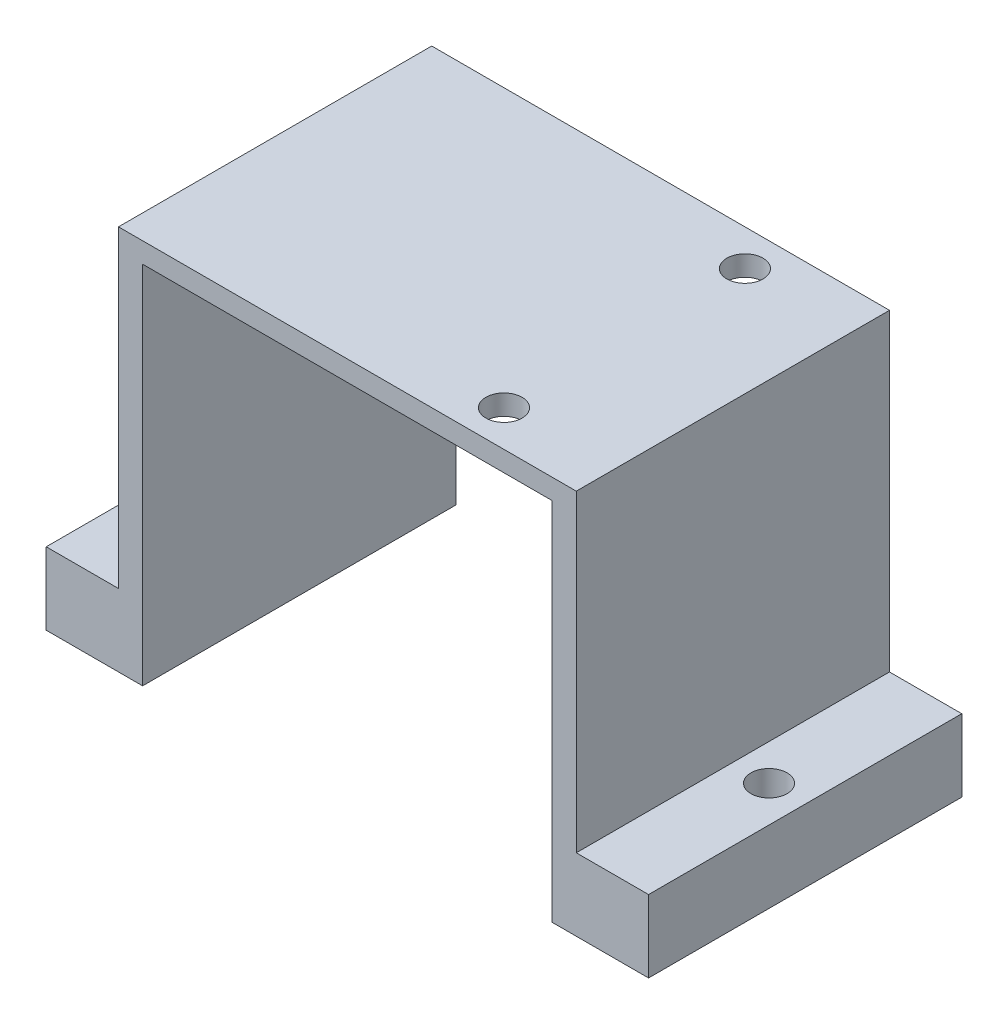
ISO-10303-21;
HEADER;
FILE_DESCRIPTION(('STEP AP214'),'2;1');
FILE_NAME('part.step','',(''),(''),'','','');
FILE_SCHEMA(('AUTOMOTIVE_DESIGN { 1 0 10303 214 1 1 1 1 }'));
ENDSEC;
DATA;
#1=APPLICATION_CONTEXT('core data for automotive mechanical design processes');
#2=APPLICATION_PROTOCOL_DEFINITION('international standard','automotive_design',2000,#1);
#3=PRODUCT_CONTEXT('',#1,'mechanical');
#4=PRODUCT('Part','Part','',(#3));
#5=PRODUCT_RELATED_PRODUCT_CATEGORY('part','',(#4));
#6=PRODUCT_DEFINITION_FORMATION('','',#4);
#7=PRODUCT_DEFINITION_CONTEXT('part definition',#1,'design');
#8=PRODUCT_DEFINITION('design','',#6,#7);
#9=PRODUCT_DEFINITION_SHAPE('','',#8);
#10=(LENGTH_UNIT() NAMED_UNIT(*) SI_UNIT(.MILLI.,.METRE.));
#11=(NAMED_UNIT(*) PLANE_ANGLE_UNIT() SI_UNIT($,.RADIAN.));
#12=(NAMED_UNIT(*) SI_UNIT($,.STERADIAN.) SOLID_ANGLE_UNIT());
#13=UNCERTAINTY_MEASURE_WITH_UNIT(LENGTH_MEASURE(1.E-05),#10,'distance_accuracy_value','');
#14=(GEOMETRIC_REPRESENTATION_CONTEXT(3) GLOBAL_UNCERTAINTY_ASSIGNED_CONTEXT((#13)) GLOBAL_UNIT_ASSIGNED_CONTEXT((#10,
#11,#12)) REPRESENTATION_CONTEXT('',''));
#15=CARTESIAN_POINT('',(0.,0.,0.));
#16=DIRECTION('',(0.,0.,1.));
#17=DIRECTION('',(1.,0.,0.));
#18=AXIS2_PLACEMENT_3D('',#15,#16,#17);
#19=CARTESIAN_POINT('',(-25.,0.,26.));
#20=DIRECTION('',(1.,0.,0.));
#21=DIRECTION('',(0.,0.,-1.));
#22=AXIS2_PLACEMENT_3D('',#19,#20,#21);
#23=PLANE('',#22);
#24=DIRECTION('',(0.,-1.,0.));
#25=VECTOR('',#24,1.);
#26=CARTESIAN_POINT('',(-25.,0.,0.));
#27=LINE('',#26,#25);
#28=CARTESIAN_POINT('',(-25.,-9.99999999999999,0.));
#29=VERTEX_POINT('',#28);
#30=CARTESIAN_POINT('',(-25.,-16.,0.));
#31=VERTEX_POINT('',#30);
#32=EDGE_CURVE('E200',#29,#31,#27,.T.);
#33=ORIENTED_EDGE('',*,*,#32,.T.);
#34=DIRECTION('',(0.,0.,-1.));
#35=VECTOR('',#34,1.);
#36=CARTESIAN_POINT('',(-25.,-16.,26.));
#37=LINE('',#36,#35);
#38=CARTESIAN_POINT('',(-25.,-16.,26.));
#39=VERTEX_POINT('',#38);
#40=EDGE_CURVE('E11',#39,#31,#37,.T.);
#41=ORIENTED_EDGE('',*,*,#40,.F.);
#42=DIRECTION('',(0.,-1.,0.));
#43=VECTOR('',#42,1.);
#44=CARTESIAN_POINT('',(-25.,0.,26.));
#45=LINE('',#44,#43);
#46=CARTESIAN_POINT('',(-25.,-9.99999999999999,26.));
#47=VERTEX_POINT('',#46);
#48=EDGE_CURVE('E209',#47,#39,#45,.T.);
#49=ORIENTED_EDGE('',*,*,#48,.F.);
#50=DIRECTION('',(0.,0.,-1.));
#51=VECTOR('',#50,1.);
#52=CARTESIAN_POINT('',(-25.,-9.99999999999999,26.));
#53=LINE('',#52,#51);
#54=EDGE_CURVE('E240',#47,#29,#53,.T.);
#55=ORIENTED_EDGE('',*,*,#54,.T.);
#56=EDGE_LOOP('',(#33,#41,#49,#55));
#57=FACE_BOUND('',#56,.T.);
#58=ADVANCED_FACE('F35',(#57),#23,.F.);
#59=CARTESIAN_POINT('',(0.,-16.,26.));
#60=DIRECTION('',(0.,1.,0.));
#61=DIRECTION('',(0.,0.,1.));
#62=AXIS2_PLACEMENT_3D('',#59,#60,#61);
#63=PLANE('',#62);
#64=CARTESIAN_POINT('',(-21.9999999999998,-16.0000000000017,13.));
#65=DIRECTION('',(0.,1.,0.));
#66=DIRECTION('',(-1.,0.,0.));
#67=AXIS2_PLACEMENT_3D('',#64,#65,#66);
#68=CIRCLE('',#67,1.5);
#69=CARTESIAN_POINT('',(-23.4999999999998,-16.0000000000018,13.));
#70=VERTEX_POINT('',#69);
#71=EDGE_CURVE('E192',#70,#70,#68,.F.);
#72=ORIENTED_EDGE('',*,*,#71,.F.);
#73=EDGE_LOOP('',(#72));
#74=FACE_BOUND('',#73,.T.);
#75=DIRECTION('',(1.,0.,0.));
#76=VECTOR('',#75,1.);
#77=CARTESIAN_POINT('',(0.,-16.,0.));
#78=LINE('',#77,#76);
#79=CARTESIAN_POINT('',(-17.,-16.,0.));
#80=VERTEX_POINT('',#79);
#81=EDGE_CURVE('E243',#31,#80,#78,.T.);
#82=ORIENTED_EDGE('',*,*,#81,.T.);
#83=DIRECTION('',(0.,0.,-1.));
#84=VECTOR('',#83,1.);
#85=CARTESIAN_POINT('',(-17.,-16.,26.));
#86=LINE('',#85,#84);
#87=CARTESIAN_POINT('',(-17.,-16.,26.));
#88=VERTEX_POINT('',#87);
#89=EDGE_CURVE('E42',#88,#80,#86,.T.);
#90=ORIENTED_EDGE('',*,*,#89,.F.);
#91=DIRECTION('',(1.,0.,0.));
#92=VECTOR('',#91,1.);
#93=CARTESIAN_POINT('',(0.,-16.,26.));
#94=LINE('',#93,#92);
#95=EDGE_CURVE('E212',#39,#88,#94,.T.);
#96=ORIENTED_EDGE('',*,*,#95,.F.);
#97=ORIENTED_EDGE('',*,*,#40,.T.);
#98=EDGE_LOOP('',(#82,#90,#96,#97));
#99=FACE_BOUND('',#98,.T.);
#100=ADVANCED_FACE('F315',(#74,#99),#63,.F.);
#101=CARTESIAN_POINT('',(-17.,0.,26.));
#102=DIRECTION('',(-1.,0.,0.));
#103=DIRECTION('',(0.,0.,1.));
#104=AXIS2_PLACEMENT_3D('',#101,#102,#103);
#105=PLANE('',#104);
#106=CARTESIAN_POINT('',(-17.,11.,8.));
#107=DIRECTION('',(-1.,0.,0.));
#108=DIRECTION('',(0.,0.,1.));
#109=AXIS2_PLACEMENT_3D('',#106,#107,#108);
#110=CIRCLE('',#109,3.);
#111=CARTESIAN_POINT('',(-17.,14.,8.));
#112=VERTEX_POINT('',#111);
#113=CARTESIAN_POINT('',(-17.,8.00000000000001,8.));
#114=VERTEX_POINT('',#113);
#115=EDGE_CURVE('E178',#112,#114,#110,.T.);
#116=ORIENTED_EDGE('',*,*,#115,.T.);
#117=DIRECTION('',(0.,0.,1.));
#118=VECTOR('',#117,1.);
#119=CARTESIAN_POINT('',(-17.,8.00000000000001,26.));
#120=LINE('',#119,#118);
#121=CARTESIAN_POINT('',(-17.,8.00000000000001,18.));
#122=VERTEX_POINT('',#121);
#123=EDGE_CURVE('E181',#114,#122,#120,.T.);
#124=ORIENTED_EDGE('',*,*,#123,.T.);
#125=CARTESIAN_POINT('',(-17.,11.,18.));
#126=DIRECTION('',(-1.,0.,0.));
#127=DIRECTION('',(0.,0.,1.));
#128=AXIS2_PLACEMENT_3D('',#125,#126,#127);
#129=CIRCLE('',#128,3.);
#130=CARTESIAN_POINT('',(-17.,14.,18.));
#131=VERTEX_POINT('',#130);
#132=EDGE_CURVE('E173',#122,#131,#129,.T.);
#133=ORIENTED_EDGE('',*,*,#132,.T.);
#134=DIRECTION('',(0.,0.,1.));
#135=VECTOR('',#134,1.);
#136=CARTESIAN_POINT('',(-17.,14.,26.));
#137=LINE('',#136,#135);
#138=EDGE_CURVE('E153',#112,#131,#137,.T.);
#139=ORIENTED_EDGE('',*,*,#138,.F.);
#140=EDGE_LOOP('',(#116,#124,#133,#139));
#141=FACE_BOUND('',#140,.T.);
#142=DIRECTION('',(0.,1.,0.));
#143=VECTOR('',#142,1.);
#144=CARTESIAN_POINT('',(-17.,0.,0.));
#145=LINE('',#144,#143);
#146=CARTESIAN_POINT('',(-17.,14.3157894736842,0.));
#147=VERTEX_POINT('',#146);
#148=EDGE_CURVE('E245',#80,#147,#145,.T.);
#149=ORIENTED_EDGE('',*,*,#148,.T.);
#150=DIRECTION('',(0.,0.,-1.));
#151=VECTOR('',#150,1.);
#152=CARTESIAN_POINT('',(-17.,14.3157894736842,26.));
#153=LINE('',#152,#151);
#154=CARTESIAN_POINT('',(-17.,14.3157894736842,26.));
#155=VERTEX_POINT('',#154);
#156=EDGE_CURVE('E290',#155,#147,#153,.T.);
#157=ORIENTED_EDGE('',*,*,#156,.F.);
#158=DIRECTION('',(0.,1.,0.));
#159=VECTOR('',#158,1.);
#160=CARTESIAN_POINT('',(-17.,0.,26.));
#161=LINE('',#160,#159);
#162=EDGE_CURVE('E215',#88,#155,#161,.T.);
#163=ORIENTED_EDGE('',*,*,#162,.F.);
#164=ORIENTED_EDGE('',*,*,#89,.T.);
#165=EDGE_LOOP('',(#149,#157,#163,#164));
#166=FACE_BOUND('',#165,.T.);
#167=ADVANCED_FACE('F297',(#141,#166),#105,.F.);
#168=CARTESIAN_POINT('',(0.,14.3157894736842,26.));
#169=DIRECTION('',(0.,1.,0.));
#170=DIRECTION('',(0.,0.,1.));
#171=AXIS2_PLACEMENT_3D('',#168,#169,#170);
#172=PLANE('',#171);
#173=CARTESIAN_POINT('',(10.,14.3157894736842,23.));
#174=DIRECTION('',(0.,-1.,0.));
#175=DIRECTION('',(0.,0.,-1.));
#176=AXIS2_PLACEMENT_3D('',#173,#174,#175);
#177=CIRCLE('',#176,1.5);
#178=CARTESIAN_POINT('',(10.,14.3157894736842,21.5));
#179=VERTEX_POINT('',#178);
#180=EDGE_CURVE('E201',#179,#179,#177,.T.);
#181=ORIENTED_EDGE('',*,*,#180,.F.);
#182=EDGE_LOOP('',(#181));
#183=FACE_BOUND('',#182,.T.);
#184=CARTESIAN_POINT('',(10.,14.3157894736842,3.));
#185=DIRECTION('',(0.,-1.,0.));
#186=DIRECTION('',(0.,0.,-1.));
#187=AXIS2_PLACEMENT_3D('',#184,#185,#186);
#188=CIRCLE('',#187,1.5);
#189=CARTESIAN_POINT('',(10.,14.3157894736842,1.5));
#190=VERTEX_POINT('',#189);
#191=EDGE_CURVE('E188',#190,#190,#188,.T.);
#192=ORIENTED_EDGE('',*,*,#191,.F.);
#193=EDGE_LOOP('',(#192));
#194=FACE_BOUND('',#193,.T.);
#195=DIRECTION('',(1.,0.,0.));
#196=VECTOR('',#195,1.);
#197=CARTESIAN_POINT('',(0.,14.3157894736842,0.));
#198=LINE('',#197,#196);
#199=CARTESIAN_POINT('',(17.,14.3157894736842,0.));
#200=VERTEX_POINT('',#199);
#201=EDGE_CURVE('E247',#147,#200,#198,.T.);
#202=ORIENTED_EDGE('',*,*,#201,.T.);
#203=DIRECTION('',(0.,0.,-1.));
#204=VECTOR('',#203,1.);
#205=CARTESIAN_POINT('',(17.,14.3157894736842,26.));
#206=LINE('',#205,#204);
#207=CARTESIAN_POINT('',(17.,14.3157894736842,26.));
#208=VERTEX_POINT('',#207);
#209=EDGE_CURVE('E288',#208,#200,#206,.T.);
#210=ORIENTED_EDGE('',*,*,#209,.F.);
#211=DIRECTION('',(1.,0.,0.));
#212=VECTOR('',#211,1.);
#213=CARTESIAN_POINT('',(0.,14.3157894736842,26.));
#214=LINE('',#213,#212);
#215=EDGE_CURVE('E217',#155,#208,#214,.T.);
#216=ORIENTED_EDGE('',*,*,#215,.F.);
#217=ORIENTED_EDGE('',*,*,#156,.T.);
#218=EDGE_LOOP('',(#202,#210,#216,#217));
#219=FACE_BOUND('',#218,.T.);
#220=ADVANCED_FACE('F308',(#183,#194,#219),#172,.F.);
#221=CARTESIAN_POINT('',(17.,0.,26.));
#222=DIRECTION('',(-1.,0.,0.));
#223=DIRECTION('',(0.,-1.,0.));
#224=AXIS2_PLACEMENT_3D('',#221,#222,#223);
#225=PLANE('',#224);
#226=DIRECTION('',(0.,1.,0.));
#227=VECTOR('',#226,1.);
#228=CARTESIAN_POINT('',(17.,0.,0.));
#229=LINE('',#228,#227);
#230=CARTESIAN_POINT('',(17.,-16.,0.));
#231=VERTEX_POINT('',#230);
#232=EDGE_CURVE('E250',#231,#200,#229,.T.);
#233=ORIENTED_EDGE('',*,*,#232,.F.);
#234=DIRECTION('',(0.,0.,-1.));
#235=VECTOR('',#234,1.);
#236=CARTESIAN_POINT('',(17.,-16.,26.));
#237=LINE('',#236,#235);
#238=CARTESIAN_POINT('',(17.,-16.,26.));
#239=VERTEX_POINT('',#238);
#240=EDGE_CURVE('E286',#239,#231,#237,.T.);
#241=ORIENTED_EDGE('',*,*,#240,.F.);
#242=DIRECTION('',(0.,1.,0.));
#243=VECTOR('',#242,1.);
#244=CARTESIAN_POINT('',(17.,0.,26.));
#245=LINE('',#244,#243);
#246=EDGE_CURVE('E219',#239,#208,#245,.T.);
#247=ORIENTED_EDGE('',*,*,#246,.T.);
#248=ORIENTED_EDGE('',*,*,#209,.T.);
#249=EDGE_LOOP('',(#233,#241,#247,#248));
#250=FACE_BOUND('',#249,.T.);
#251=ADVANCED_FACE('F342',(#250),#225,.T.);
#252=CARTESIAN_POINT('',(0.,-16.,26.));
#253=DIRECTION('',(0.,1.,0.));
#254=DIRECTION('',(-1.,0.,0.));
#255=AXIS2_PLACEMENT_3D('',#252,#253,#254);
#256=PLANE('',#255);
#257=CARTESIAN_POINT('',(22.0000000000002,-16.0000000000001,13.));
#258=DIRECTION('',(0.,1.,0.));
#259=DIRECTION('',(-1.,0.,0.));
#260=AXIS2_PLACEMENT_3D('',#257,#258,#259);
#261=CIRCLE('',#260,1.5);
#262=CARTESIAN_POINT('',(20.5000000000002,-16.0000000000002,13.));
#263=VERTEX_POINT('',#262);
#264=EDGE_CURVE('E185',#263,#263,#261,.T.);
#265=ORIENTED_EDGE('',*,*,#264,.T.);
#266=EDGE_LOOP('',(#265));
#267=FACE_BOUND('',#266,.T.);
#268=DIRECTION('',(1.,0.,0.));
#269=VECTOR('',#268,1.);
#270=CARTESIAN_POINT('',(0.,-16.,0.));
#271=LINE('',#270,#269);
#272=CARTESIAN_POINT('',(25.,-16.,0.));
#273=VERTEX_POINT('',#272);
#274=EDGE_CURVE('E253',#231,#273,#271,.T.);
#275=ORIENTED_EDGE('',*,*,#274,.T.);
#276=DIRECTION('',(0.,0.,-1.));
#277=VECTOR('',#276,1.);
#278=CARTESIAN_POINT('',(25.,-16.,26.));
#279=LINE('',#278,#277);
#280=CARTESIAN_POINT('',(25.,-16.,26.));
#281=VERTEX_POINT('',#280);
#282=EDGE_CURVE('E284',#281,#273,#279,.T.);
#283=ORIENTED_EDGE('',*,*,#282,.F.);
#284=DIRECTION('',(1.,0.,0.));
#285=VECTOR('',#284,1.);
#286=CARTESIAN_POINT('',(0.,-16.,26.));
#287=LINE('',#286,#285);
#288=EDGE_CURVE('E222',#239,#281,#287,.T.);
#289=ORIENTED_EDGE('',*,*,#288,.F.);
#290=ORIENTED_EDGE('',*,*,#240,.T.);
#291=EDGE_LOOP('',(#275,#283,#289,#290));
#292=FACE_BOUND('',#291,.T.);
#293=ADVANCED_FACE('F344',(#267,#292),#256,.F.);
#294=CARTESIAN_POINT('',(25.,0.,26.));
#295=DIRECTION('',(1.,0.,0.));
#296=DIRECTION('',(0.,0.,-1.));
#297=AXIS2_PLACEMENT_3D('',#294,#295,#296);
#298=PLANE('',#297);
#299=DIRECTION('',(0.,-1.,0.));
#300=VECTOR('',#299,1.);
#301=CARTESIAN_POINT('',(25.,0.,0.));
#302=LINE('',#301,#300);
#303=CARTESIAN_POINT('',(25.,-9.99999999999999,0.));
#304=VERTEX_POINT('',#303);
#305=EDGE_CURVE('E256',#304,#273,#302,.T.);
#306=ORIENTED_EDGE('',*,*,#305,.F.);
#307=DIRECTION('',(0.,0.,-1.));
#308=VECTOR('',#307,1.);
#309=CARTESIAN_POINT('',(25.,-9.99999999999999,26.));
#310=LINE('',#309,#308);
#311=CARTESIAN_POINT('',(25.,-9.99999999999999,26.));
#312=VERTEX_POINT('',#311);
#313=EDGE_CURVE('E282',#312,#304,#310,.T.);
#314=ORIENTED_EDGE('',*,*,#313,.F.);
#315=DIRECTION('',(0.,-1.,0.));
#316=VECTOR('',#315,1.);
#317=CARTESIAN_POINT('',(25.,0.,26.));
#318=LINE('',#317,#316);
#319=EDGE_CURVE('E224',#312,#281,#318,.T.);
#320=ORIENTED_EDGE('',*,*,#319,.T.);
#321=ORIENTED_EDGE('',*,*,#282,.T.);
#322=EDGE_LOOP('',(#306,#314,#320,#321));
#323=FACE_BOUND('',#322,.T.);
#324=ADVANCED_FACE('F338',(#323),#298,.T.);
#325=CARTESIAN_POINT('',(0.,-9.99999999999999,26.));
#326=DIRECTION('',(0.,1.,0.));
#327=DIRECTION('',(-1.,0.,0.));
#328=AXIS2_PLACEMENT_3D('',#325,#326,#327);
#329=PLANE('',#328);
#330=CARTESIAN_POINT('',(22.,-9.99999999999917,13.));
#331=DIRECTION('',(0.,1.,0.));
#332=DIRECTION('',(-1.,0.,0.));
#333=AXIS2_PLACEMENT_3D('',#330,#331,#332);
#334=CIRCLE('',#333,1.5);
#335=CARTESIAN_POINT('',(20.5,-9.99999999999923,13.));
#336=VERTEX_POINT('',#335);
#337=EDGE_CURVE('E189',#336,#336,#334,.T.);
#338=ORIENTED_EDGE('',*,*,#337,.F.);
#339=EDGE_LOOP('',(#338));
#340=FACE_BOUND('',#339,.T.);
#341=DIRECTION('',(1.,0.,0.));
#342=VECTOR('',#341,1.);
#343=CARTESIAN_POINT('',(0.,-9.99999999999999,0.));
#344=LINE('',#343,#342);
#345=CARTESIAN_POINT('',(19.,-9.99999999999999,0.));
#346=VERTEX_POINT('',#345);
#347=EDGE_CURVE('E259',#346,#304,#344,.T.);
#348=ORIENTED_EDGE('',*,*,#347,.F.);
#349=DIRECTION('',(0.,0.,-1.));
#350=VECTOR('',#349,1.);
#351=CARTESIAN_POINT('',(19.,-9.99999999999999,26.));
#352=LINE('',#351,#350);
#353=CARTESIAN_POINT('',(19.,-9.99999999999999,26.));
#354=VERTEX_POINT('',#353);
#355=EDGE_CURVE('E280',#354,#346,#352,.T.);
#356=ORIENTED_EDGE('',*,*,#355,.F.);
#357=DIRECTION('',(1.,0.,0.));
#358=VECTOR('',#357,1.);
#359=CARTESIAN_POINT('',(0.,-9.99999999999999,26.));
#360=LINE('',#359,#358);
#361=EDGE_CURVE('E227',#354,#312,#360,.T.);
#362=ORIENTED_EDGE('',*,*,#361,.T.);
#363=ORIENTED_EDGE('',*,*,#313,.T.);
#364=EDGE_LOOP('',(#348,#356,#362,#363));
#365=FACE_BOUND('',#364,.T.);
#366=ADVANCED_FACE('F332',(#340,#365),#329,.T.);
#367=CARTESIAN_POINT('',(19.,0.,26.));
#368=DIRECTION('',(-1.,0.,0.));
#369=DIRECTION('',(0.,-1.,0.));
#370=AXIS2_PLACEMENT_3D('',#367,#368,#369);
#371=PLANE('',#370);
#372=DIRECTION('',(0.,1.,0.));
#373=VECTOR('',#372,1.);
#374=CARTESIAN_POINT('',(19.,0.,0.));
#375=LINE('',#374,#373);
#376=CARTESIAN_POINT('',(19.,16.,0.));
#377=VERTEX_POINT('',#376);
#378=EDGE_CURVE('E262',#346,#377,#375,.T.);
#379=ORIENTED_EDGE('',*,*,#378,.T.);
#380=DIRECTION('',(0.,0.,-1.));
#381=VECTOR('',#380,1.);
#382=CARTESIAN_POINT('',(19.,16.,26.));
#383=LINE('',#382,#381);
#384=CARTESIAN_POINT('',(19.,16.,26.));
#385=VERTEX_POINT('',#384);
#386=EDGE_CURVE('E278',#385,#377,#383,.T.);
#387=ORIENTED_EDGE('',*,*,#386,.F.);
#388=DIRECTION('',(0.,1.,0.));
#389=VECTOR('',#388,1.);
#390=CARTESIAN_POINT('',(19.,0.,26.));
#391=LINE('',#390,#389);
#392=EDGE_CURVE('E230',#354,#385,#391,.T.);
#393=ORIENTED_EDGE('',*,*,#392,.F.);
#394=ORIENTED_EDGE('',*,*,#355,.T.);
#395=EDGE_LOOP('',(#379,#387,#393,#394));
#396=FACE_BOUND('',#395,.T.);
#397=ADVANCED_FACE('F345',(#396),#371,.F.);
#398=CARTESIAN_POINT('',(0.,16.,26.));
#399=DIRECTION('',(0.,1.,0.));
#400=DIRECTION('',(0.,0.,1.));
#401=AXIS2_PLACEMENT_3D('',#398,#399,#400);
#402=PLANE('',#401);
#403=CARTESIAN_POINT('',(10.,16.,23.));
#404=DIRECTION('',(0.,-1.,0.));
#405=DIRECTION('',(0.,0.,-1.));
#406=AXIS2_PLACEMENT_3D('',#403,#404,#405);
#407=CIRCLE('',#406,1.5);
#408=CARTESIAN_POINT('',(10.,16.,21.5));
#409=VERTEX_POINT('',#408);
#410=EDGE_CURVE('E197',#409,#409,#407,.T.);
#411=ORIENTED_EDGE('',*,*,#410,.T.);
#412=EDGE_LOOP('',(#411));
#413=FACE_BOUND('',#412,.T.);
#414=CARTESIAN_POINT('',(10.,16.,3.));
#415=DIRECTION('',(0.,-1.,0.));
#416=DIRECTION('',(0.,0.,-1.));
#417=AXIS2_PLACEMENT_3D('',#414,#415,#416);
#418=CIRCLE('',#417,1.5);
#419=CARTESIAN_POINT('',(10.,16.,1.5));
#420=VERTEX_POINT('',#419);
#421=EDGE_CURVE('E204',#420,#420,#418,.T.);
#422=ORIENTED_EDGE('',*,*,#421,.T.);
#423=EDGE_LOOP('',(#422));
#424=FACE_BOUND('',#423,.T.);
#425=DIRECTION('',(1.,0.,0.));
#426=VECTOR('',#425,1.);
#427=CARTESIAN_POINT('',(0.,16.,0.));
#428=LINE('',#427,#426);
#429=CARTESIAN_POINT('',(-19.,16.,0.));
#430=VERTEX_POINT('',#429);
#431=EDGE_CURVE('E265',#430,#377,#428,.T.);
#432=ORIENTED_EDGE('',*,*,#431,.F.);
#433=DIRECTION('',(0.,0.,-1.));
#434=VECTOR('',#433,1.);
#435=CARTESIAN_POINT('',(-19.,16.,26.));
#436=LINE('',#435,#434);
#437=CARTESIAN_POINT('',(-19.,16.,26.));
#438=VERTEX_POINT('',#437);
#439=EDGE_CURVE('E276',#438,#430,#436,.T.);
#440=ORIENTED_EDGE('',*,*,#439,.F.);
#441=DIRECTION('',(1.,0.,0.));
#442=VECTOR('',#441,1.);
#443=CARTESIAN_POINT('',(0.,16.,26.));
#444=LINE('',#443,#442);
#445=EDGE_CURVE('E232',#438,#385,#444,.T.);
#446=ORIENTED_EDGE('',*,*,#445,.T.);
#447=ORIENTED_EDGE('',*,*,#386,.T.);
#448=EDGE_LOOP('',(#432,#440,#446,#447));
#449=FACE_BOUND('',#448,.T.);
#450=ADVANCED_FACE('F326',(#413,#424,#449),#402,.T.);
#451=CARTESIAN_POINT('',(-19.,0.,26.));
#452=DIRECTION('',(-1.,0.,0.));
#453=DIRECTION('',(0.,-1.,0.));
#454=AXIS2_PLACEMENT_3D('',#451,#452,#453);
#455=PLANE('',#454);
#456=DIRECTION('',(0.,0.,1.));
#457=VECTOR('',#456,1.);
#458=CARTESIAN_POINT('',(-19.,8.00000000000001,0.));
#459=LINE('',#458,#457);
#460=CARTESIAN_POINT('',(-19.,8.00000000000001,8.));
#461=VERTEX_POINT('',#460);
#462=CARTESIAN_POINT('',(-19.,8.00000000000001,18.));
#463=VERTEX_POINT('',#462);
#464=EDGE_CURVE('E57',#461,#463,#459,.T.);
#465=ORIENTED_EDGE('',*,*,#464,.F.);
#466=CARTESIAN_POINT('',(-19.,11.,8.));
#467=DIRECTION('',(-1.,0.,0.));
#468=DIRECTION('',(0.,-1.,0.));
#469=AXIS2_PLACEMENT_3D('',#466,#467,#468);
#470=CIRCLE('',#469,3.);
#471=CARTESIAN_POINT('',(-19.,14.,8.));
#472=VERTEX_POINT('',#471);
#473=EDGE_CURVE('E166',#472,#461,#470,.T.);
#474=ORIENTED_EDGE('',*,*,#473,.F.);
#475=DIRECTION('',(0.,0.,1.));
#476=VECTOR('',#475,1.);
#477=CARTESIAN_POINT('',(-19.,14.,0.));
#478=LINE('',#477,#476);
#479=CARTESIAN_POINT('',(-19.,14.,18.));
#480=VERTEX_POINT('',#479);
#481=EDGE_CURVE('E150',#472,#480,#478,.T.);
#482=ORIENTED_EDGE('',*,*,#481,.T.);
#483=CARTESIAN_POINT('',(-19.,11.,18.));
#484=DIRECTION('',(-1.,0.,0.));
#485=DIRECTION('',(0.,-1.,0.));
#486=AXIS2_PLACEMENT_3D('',#483,#484,#485);
#487=CIRCLE('',#486,3.);
#488=EDGE_CURVE('E159',#463,#480,#487,.T.);
#489=ORIENTED_EDGE('',*,*,#488,.F.);
#490=EDGE_LOOP('',(#465,#474,#482,#489));
#491=FACE_BOUND('',#490,.T.);
#492=DIRECTION('',(0.,1.,0.));
#493=VECTOR('',#492,1.);
#494=CARTESIAN_POINT('',(-19.,0.,0.));
#495=LINE('',#494,#493);
#496=CARTESIAN_POINT('',(-19.,-9.99999999999999,0.));
#497=VERTEX_POINT('',#496);
#498=EDGE_CURVE('E268',#497,#430,#495,.T.);
#499=ORIENTED_EDGE('',*,*,#498,.F.);
#500=DIRECTION('',(0.,0.,-1.));
#501=VECTOR('',#500,1.);
#502=CARTESIAN_POINT('',(-19.,-9.99999999999999,26.));
#503=LINE('',#502,#501);
#504=CARTESIAN_POINT('',(-19.,-9.99999999999999,26.));
#505=VERTEX_POINT('',#504);
#506=EDGE_CURVE('E274',#505,#497,#503,.T.);
#507=ORIENTED_EDGE('',*,*,#506,.F.);
#508=DIRECTION('',(0.,1.,0.));
#509=VECTOR('',#508,1.);
#510=CARTESIAN_POINT('',(-19.,0.,26.));
#511=LINE('',#510,#509);
#512=EDGE_CURVE('E235',#505,#438,#511,.T.);
#513=ORIENTED_EDGE('',*,*,#512,.T.);
#514=ORIENTED_EDGE('',*,*,#439,.T.);
#515=EDGE_LOOP('',(#499,#507,#513,#514));
#516=FACE_BOUND('',#515,.T.);
#517=ADVANCED_FACE('F163',(#491,#516),#455,.T.);
#518=CARTESIAN_POINT('',(0.,-9.99999999999999,26.));
#519=DIRECTION('',(0.,-1.,0.));
#520=DIRECTION('',(1.,0.,0.));
#521=AXIS2_PLACEMENT_3D('',#518,#519,#520);
#522=PLANE('',#521);
#523=CARTESIAN_POINT('',(-22.,-10.0000000000008,13.));
#524=DIRECTION('',(0.,1.,0.));
#525=DIRECTION('',(-1.,0.,0.));
#526=AXIS2_PLACEMENT_3D('',#523,#524,#525);
#527=CIRCLE('',#526,1.5);
#528=CARTESIAN_POINT('',(-23.5,-10.0000000000009,13.));
#529=VERTEX_POINT('',#528);
#530=EDGE_CURVE('E184',#529,#529,#527,.F.);
#531=ORIENTED_EDGE('',*,*,#530,.T.);
#532=EDGE_LOOP('',(#531));
#533=FACE_BOUND('',#532,.T.);
#534=DIRECTION('',(-1.,0.,0.));
#535=VECTOR('',#534,1.);
#536=CARTESIAN_POINT('',(0.,-9.99999999999999,0.));
#537=LINE('',#536,#535);
#538=EDGE_CURVE('E213',#497,#29,#537,.T.);
#539=ORIENTED_EDGE('',*,*,#538,.T.);
#540=ORIENTED_EDGE('',*,*,#54,.F.);
#541=DIRECTION('',(-1.,0.,0.));
#542=VECTOR('',#541,1.);
#543=CARTESIAN_POINT('',(0.,-9.99999999999999,26.));
#544=LINE('',#543,#542);
#545=EDGE_CURVE('E238',#505,#47,#544,.T.);
#546=ORIENTED_EDGE('',*,*,#545,.F.);
#547=ORIENTED_EDGE('',*,*,#506,.T.);
#548=EDGE_LOOP('',(#539,#540,#546,#547));
#549=FACE_BOUND('',#548,.T.);
#550=ADVANCED_FACE('F394',(#533,#549),#522,.F.);
#551=CARTESIAN_POINT('',(0.,0.,26.));
#552=DIRECTION('',(0.,0.,1.));
#553=DIRECTION('',(1.,0.,0.));
#554=AXIS2_PLACEMENT_3D('',#551,#552,#553);
#555=PLANE('',#554);
#556=ORIENTED_EDGE('',*,*,#48,.T.);
#557=ORIENTED_EDGE('',*,*,#95,.T.);
#558=ORIENTED_EDGE('',*,*,#162,.T.);
#559=ORIENTED_EDGE('',*,*,#215,.T.);
#560=ORIENTED_EDGE('',*,*,#246,.F.);
#561=ORIENTED_EDGE('',*,*,#288,.T.);
#562=ORIENTED_EDGE('',*,*,#319,.F.);
#563=ORIENTED_EDGE('',*,*,#361,.F.);
#564=ORIENTED_EDGE('',*,*,#392,.T.);
#565=ORIENTED_EDGE('',*,*,#445,.F.);
#566=ORIENTED_EDGE('',*,*,#512,.F.);
#567=ORIENTED_EDGE('',*,*,#545,.T.);
#568=EDGE_LOOP('',(#556,#557,#558,#559,#560,#561,#562,#563,#564,#565,#566,#567));
#569=FACE_BOUND('',#568,.T.);
#570=ADVANCED_FACE('F312',(#569),#555,.T.);
#571=CARTESIAN_POINT('',(0.,0.,0.));
#572=DIRECTION('',(0.,0.,1.));
#573=DIRECTION('',(1.,0.,0.));
#574=AXIS2_PLACEMENT_3D('',#571,#572,#573);
#575=PLANE('',#574);
#576=ORIENTED_EDGE('',*,*,#32,.F.);
#577=ORIENTED_EDGE('',*,*,#538,.F.);
#578=ORIENTED_EDGE('',*,*,#498,.T.);
#579=ORIENTED_EDGE('',*,*,#431,.T.);
#580=ORIENTED_EDGE('',*,*,#378,.F.);
#581=ORIENTED_EDGE('',*,*,#347,.T.);
#582=ORIENTED_EDGE('',*,*,#305,.T.);
#583=ORIENTED_EDGE('',*,*,#274,.F.);
#584=ORIENTED_EDGE('',*,*,#232,.T.);
#585=ORIENTED_EDGE('',*,*,#201,.F.);
#586=ORIENTED_EDGE('',*,*,#148,.F.);
#587=ORIENTED_EDGE('',*,*,#81,.F.);
#588=EDGE_LOOP('',(#576,#577,#578,#579,#580,#581,#582,#583,#584,#585,#586,#587));
#589=FACE_BOUND('',#588,.T.);
#590=ADVANCED_FACE('F303',(#589),#575,.F.);
#591=CARTESIAN_POINT('',(10.,16.,3.));
#592=DIRECTION('',(0.,-1.,0.));
#593=DIRECTION('',(0.,0.,-1.));
#594=AXIS2_PLACEMENT_3D('',#591,#592,#593);
#595=CYLINDRICAL_SURFACE('',#594,1.5);
#596=ORIENTED_EDGE('',*,*,#421,.F.);
#597=EDGE_LOOP('',(#596));
#598=FACE_BOUND('',#597,.T.);
#599=ORIENTED_EDGE('',*,*,#191,.T.);
#600=EDGE_LOOP('',(#599));
#601=FACE_BOUND('',#600,.T.);
#602=ADVANCED_FACE('F482',(#598,#601),#595,.F.);
#603=CARTESIAN_POINT('',(10.,16.,23.));
#604=DIRECTION('',(0.,-1.,0.));
#605=DIRECTION('',(0.,0.,-1.));
#606=AXIS2_PLACEMENT_3D('',#603,#604,#605);
#607=CYLINDRICAL_SURFACE('',#606,1.5);
#608=ORIENTED_EDGE('',*,*,#410,.F.);
#609=EDGE_LOOP('',(#608));
#610=FACE_BOUND('',#609,.T.);
#611=ORIENTED_EDGE('',*,*,#180,.T.);
#612=EDGE_LOOP('',(#611));
#613=FACE_BOUND('',#612,.T.);
#614=ADVANCED_FACE('F414',(#610,#613),#607,.F.);
#615=CARTESIAN_POINT('',(-21.9999999999998,-16.0000000000017,13.));
#616=DIRECTION('',(0.,1.,0.));
#617=DIRECTION('',(-1.,0.,0.));
#618=AXIS2_PLACEMENT_3D('',#615,#616,#617);
#619=CYLINDRICAL_SURFACE('',#618,1.5);
#620=ORIENTED_EDGE('',*,*,#71,.T.);
#621=EDGE_LOOP('',(#620));
#622=FACE_BOUND('',#621,.T.);
#623=ORIENTED_EDGE('',*,*,#530,.F.);
#624=EDGE_LOOP('',(#623));
#625=FACE_BOUND('',#624,.T.);
#626=ADVANCED_FACE('F408',(#622,#625),#619,.F.);
#627=CARTESIAN_POINT('',(22.0000000000002,-16.0000000000001,13.));
#628=DIRECTION('',(0.,1.,0.));
#629=DIRECTION('',(-1.,0.,0.));
#630=AXIS2_PLACEMENT_3D('',#627,#628,#629);
#631=CYLINDRICAL_SURFACE('',#630,1.5);
#632=ORIENTED_EDGE('',*,*,#264,.F.);
#633=EDGE_LOOP('',(#632));
#634=FACE_BOUND('',#633,.T.);
#635=ORIENTED_EDGE('',*,*,#337,.T.);
#636=EDGE_LOOP('',(#635));
#637=FACE_BOUND('',#636,.T.);
#638=ADVANCED_FACE('F413',(#634,#637),#631,.F.);
#639=CARTESIAN_POINT('',(-9.00000000000001,8.00000000000001,0.));
#640=DIRECTION('',(0.,-1.,0.));
#641=DIRECTION('',(1.,0.,0.));
#642=AXIS2_PLACEMENT_3D('',#639,#640,#641);
#643=PLANE('',#642);
#644=DIRECTION('',(-1.,0.,0.));
#645=VECTOR('',#644,1.);
#646=CARTESIAN_POINT('',(-9.00000000000001,8.00000000000001,8.));
#647=LINE('',#646,#645);
#648=EDGE_CURVE('E171',#114,#461,#647,.T.);
#649=ORIENTED_EDGE('',*,*,#648,.T.);
#650=ORIENTED_EDGE('',*,*,#464,.T.);
#651=DIRECTION('',(-1.,0.,0.));
#652=VECTOR('',#651,1.);
#653=CARTESIAN_POINT('',(-9.00000000000001,8.00000000000001,18.));
#654=LINE('',#653,#652);
#655=EDGE_CURVE('E156',#122,#463,#654,.T.);
#656=ORIENTED_EDGE('',*,*,#655,.F.);
#657=ORIENTED_EDGE('',*,*,#123,.F.);
#658=EDGE_LOOP('',(#649,#650,#656,#657));
#659=FACE_BOUND('',#658,.T.);
#660=ADVANCED_FACE('F426',(#659),#643,.F.);
#661=CARTESIAN_POINT('',(-9.00000000000001,11.,8.));
#662=DIRECTION('',(-1.,0.,0.));
#663=DIRECTION('',(0.,-1.,0.));
#664=AXIS2_PLACEMENT_3D('',#661,#662,#663);
#665=CYLINDRICAL_SURFACE('',#664,3.);
#666=DIRECTION('',(-1.,0.,0.));
#667=VECTOR('',#666,1.);
#668=CARTESIAN_POINT('',(-9.00000000000001,14.,8.));
#669=LINE('',#668,#667);
#670=EDGE_CURVE('E155',#112,#472,#669,.T.);
#671=ORIENTED_EDGE('',*,*,#670,.T.);
#672=ORIENTED_EDGE('',*,*,#473,.T.);
#673=ORIENTED_EDGE('',*,*,#648,.F.);
#674=ORIENTED_EDGE('',*,*,#115,.F.);
#675=EDGE_LOOP('',(#671,#672,#673,#674));
#676=FACE_BOUND('',#675,.T.);
#677=ADVANCED_FACE('F451',(#676),#665,.F.);
#678=CARTESIAN_POINT('',(-9.00000000000001,14.,0.));
#679=DIRECTION('',(0.,-1.,0.));
#680=DIRECTION('',(1.,0.,0.));
#681=AXIS2_PLACEMENT_3D('',#678,#679,#680);
#682=PLANE('',#681);
#683=ORIENTED_EDGE('',*,*,#138,.T.);
#684=DIRECTION('',(-1.,0.,0.));
#685=VECTOR('',#684,1.);
#686=CARTESIAN_POINT('',(-9.00000000000001,14.,18.));
#687=LINE('',#686,#685);
#688=EDGE_CURVE('E49',#131,#480,#687,.T.);
#689=ORIENTED_EDGE('',*,*,#688,.T.);
#690=ORIENTED_EDGE('',*,*,#481,.F.);
#691=ORIENTED_EDGE('',*,*,#670,.F.);
#692=EDGE_LOOP('',(#683,#689,#690,#691));
#693=FACE_BOUND('',#692,.T.);
#694=ADVANCED_FACE('F147',(#693),#682,.T.);
#695=CARTESIAN_POINT('',(-9.00000000000001,11.,18.));
#696=DIRECTION('',(-1.,0.,0.));
#697=DIRECTION('',(0.,-1.,0.));
#698=AXIS2_PLACEMENT_3D('',#695,#696,#697);
#699=CYLINDRICAL_SURFACE('',#698,3.);
#700=ORIENTED_EDGE('',*,*,#655,.T.);
#701=ORIENTED_EDGE('',*,*,#488,.T.);
#702=ORIENTED_EDGE('',*,*,#688,.F.);
#703=ORIENTED_EDGE('',*,*,#132,.F.);
#704=EDGE_LOOP('',(#700,#701,#702,#703));
#705=FACE_BOUND('',#704,.T.);
#706=ADVANCED_FACE('F160',(#705),#699,.F.);
#707=CLOSED_SHELL('',(#58,#100,#167,#220,#251,#293,#324,#366,#397,#450,#517,#550,#570,#590,#602,
#614,#626,#638,#660,#677,#694,#706));
#708=MANIFOLD_SOLID_BREP('B2',#707);
#709=ADVANCED_BREP_SHAPE_REPRESENTATION('',(#18,#708),#14);
#710=SHAPE_DEFINITION_REPRESENTATION(#9,#709);
ENDSEC;
END-ISO-10303-21;
